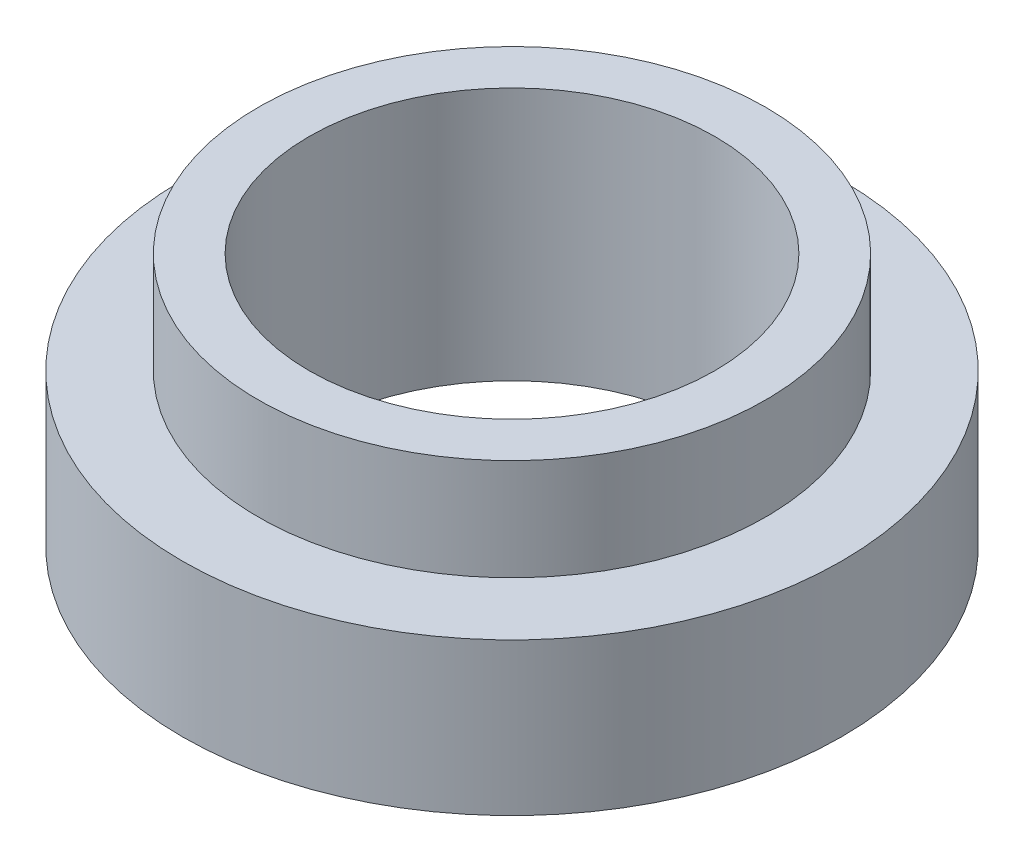
ISO-10303-21;
HEADER;
FILE_DESCRIPTION(('STEP AP214'),'2;1');
FILE_NAME('part.step','',(''),(''),'','','');
FILE_SCHEMA(('AUTOMOTIVE_DESIGN { 1 0 10303 214 1 1 1 1 }'));
ENDSEC;
DATA;
#1=APPLICATION_CONTEXT('core data for automotive mechanical design processes');
#2=APPLICATION_PROTOCOL_DEFINITION('international standard','automotive_design',2000,#1);
#3=PRODUCT_CONTEXT('',#1,'mechanical');
#4=PRODUCT('Part','Part','',(#3));
#5=PRODUCT_RELATED_PRODUCT_CATEGORY('part','',(#4));
#6=PRODUCT_DEFINITION_FORMATION('','',#4);
#7=PRODUCT_DEFINITION_CONTEXT('part definition',#1,'design');
#8=PRODUCT_DEFINITION('design','',#6,#7);
#9=PRODUCT_DEFINITION_SHAPE('','',#8);
#10=(LENGTH_UNIT() NAMED_UNIT(*) SI_UNIT(.MILLI.,.METRE.));
#11=(NAMED_UNIT(*) PLANE_ANGLE_UNIT() SI_UNIT($,.RADIAN.));
#12=(NAMED_UNIT(*) SI_UNIT($,.STERADIAN.) SOLID_ANGLE_UNIT());
#13=UNCERTAINTY_MEASURE_WITH_UNIT(LENGTH_MEASURE(1.E-05),#10,'distance_accuracy_value','');
#14=(GEOMETRIC_REPRESENTATION_CONTEXT(3) GLOBAL_UNCERTAINTY_ASSIGNED_CONTEXT((#13)) GLOBAL_UNIT_ASSIGNED_CONTEXT((#10,
#11,#12)) REPRESENTATION_CONTEXT('',''));
#15=CARTESIAN_POINT('',(0.,0.,0.));
#16=DIRECTION('',(0.,0.,1.));
#17=DIRECTION('',(1.,0.,0.));
#18=AXIS2_PLACEMENT_3D('',#15,#16,#17);
#19=CARTESIAN_POINT('',(0.,0.,0.));
#20=DIRECTION('',(0.,-1.,0.));
#21=DIRECTION('',(0.,0.,-1.));
#22=AXIS2_PLACEMENT_3D('',#19,#20,#21);
#23=CYLINDRICAL_SURFACE('',#22,6.50000000000001);
#24=CARTESIAN_POINT('',(0.,14.3177897024861,0.));
#25=DIRECTION('',(0.,-1.,0.));
#26=DIRECTION('',(0.,0.,-1.));
#27=AXIS2_PLACEMENT_3D('',#24,#25,#26);
#28=CIRCLE('',#27,6.50000000000001);
#29=CARTESIAN_POINT('',(0.,14.3177897024861,-6.50000000000001));
#30=VERTEX_POINT('',#29);
#31=EDGE_CURVE('E53',#30,#30,#28,.T.);
#32=ORIENTED_EDGE('',*,*,#31,.F.);
#33=EDGE_LOOP('',(#32));
#34=FACE_BOUND('',#33,.T.);
#35=CARTESIAN_POINT('',(0.,17.3177897024861,0.));
#36=DIRECTION('',(0.,-1.,0.));
#37=DIRECTION('',(0.,0.,-1.));
#38=AXIS2_PLACEMENT_3D('',#35,#36,#37);
#39=CIRCLE('',#38,6.50000000000001);
#40=CARTESIAN_POINT('',(0.,17.3177897024861,-6.50000000000001));
#41=VERTEX_POINT('',#40);
#42=EDGE_CURVE('E10',#41,#41,#39,.T.);
#43=ORIENTED_EDGE('',*,*,#42,.T.);
#44=EDGE_LOOP('',(#43));
#45=FACE_BOUND('',#44,.T.);
#46=ADVANCED_FACE('F31',(#34,#45),#23,.T.);
#47=CARTESIAN_POINT('',(-6.50000000000001,17.3177897024861,0.));
#48=DIRECTION('',(0.,-1.,0.));
#49=DIRECTION('',(0.,0.,-1.));
#50=AXIS2_PLACEMENT_3D('',#47,#48,#49);
#51=PLANE('',#50);
#52=ORIENTED_EDGE('',*,*,#42,.F.);
#53=EDGE_LOOP('',(#52));
#54=FACE_BOUND('',#53,.T.);
#55=CARTESIAN_POINT('',(0.,17.3177897024861,0.));
#56=DIRECTION('',(0.,-1.,0.));
#57=DIRECTION('',(0.,0.,-1.));
#58=AXIS2_PLACEMENT_3D('',#55,#56,#57);
#59=CIRCLE('',#58,4.99999999999999);
#60=CARTESIAN_POINT('',(0.,17.3177897024861,-4.99999999999999));
#61=VERTEX_POINT('',#60);
#62=EDGE_CURVE('E37',#61,#61,#59,.T.);
#63=ORIENTED_EDGE('',*,*,#62,.T.);
#64=EDGE_LOOP('',(#63));
#65=FACE_BOUND('',#64,.T.);
#66=ADVANCED_FACE('F60',(#54,#65),#51,.F.);
#67=CARTESIAN_POINT('',(0.,0.,0.));
#68=DIRECTION('',(0.,-1.,0.));
#69=DIRECTION('',(0.,0.,-1.));
#70=AXIS2_PLACEMENT_3D('',#67,#68,#69);
#71=CYLINDRICAL_SURFACE('',#70,5.);
#72=ORIENTED_EDGE('',*,*,#62,.F.);
#73=EDGE_LOOP('',(#72));
#74=FACE_BOUND('',#73,.T.);
#75=CARTESIAN_POINT('',(0.,19.3177897024861,0.));
#76=DIRECTION('',(0.,-1.,0.));
#77=DIRECTION('',(0.,0.,-1.));
#78=AXIS2_PLACEMENT_3D('',#75,#76,#77);
#79=CIRCLE('',#78,5.);
#80=CARTESIAN_POINT('',(0.,19.3177897024861,-5.));
#81=VERTEX_POINT('',#80);
#82=EDGE_CURVE('E41',#81,#81,#79,.T.);
#83=ORIENTED_EDGE('',*,*,#82,.T.);
#84=EDGE_LOOP('',(#83));
#85=FACE_BOUND('',#84,.T.);
#86=ADVANCED_FACE('F64',(#74,#85),#71,.T.);
#87=CARTESIAN_POINT('',(-5.,19.3177897024861,0.));
#88=DIRECTION('',(0.,-1.,0.));
#89=DIRECTION('',(0.,0.,-1.));
#90=AXIS2_PLACEMENT_3D('',#87,#88,#89);
#91=PLANE('',#90);
#92=ORIENTED_EDGE('',*,*,#82,.F.);
#93=EDGE_LOOP('',(#92));
#94=FACE_BOUND('',#93,.T.);
#95=CARTESIAN_POINT('',(0.,19.3177897024861,0.));
#96=DIRECTION('',(0.,-1.,0.));
#97=DIRECTION('',(0.,0.,-1.));
#98=AXIS2_PLACEMENT_3D('',#95,#96,#97);
#99=CIRCLE('',#98,4.);
#100=CARTESIAN_POINT('',(0.,19.3177897024861,-4.));
#101=VERTEX_POINT('',#100);
#102=EDGE_CURVE('E45',#101,#101,#99,.T.);
#103=ORIENTED_EDGE('',*,*,#102,.T.);
#104=EDGE_LOOP('',(#103));
#105=FACE_BOUND('',#104,.T.);
#106=ADVANCED_FACE('F69',(#94,#105),#91,.F.);
#107=CARTESIAN_POINT('',(0.,0.,0.));
#108=DIRECTION('',(0.,-1.,0.));
#109=DIRECTION('',(0.,0.,-1.));
#110=AXIS2_PLACEMENT_3D('',#107,#108,#109);
#111=CYLINDRICAL_SURFACE('',#110,4.);
#112=ORIENTED_EDGE('',*,*,#102,.F.);
#113=EDGE_LOOP('',(#112));
#114=FACE_BOUND('',#113,.T.);
#115=CARTESIAN_POINT('',(0.,14.3177897024861,0.));
#116=DIRECTION('',(0.,-1.,0.));
#117=DIRECTION('',(0.,0.,-1.));
#118=AXIS2_PLACEMENT_3D('',#115,#116,#117);
#119=CIRCLE('',#118,4.);
#120=CARTESIAN_POINT('',(0.,14.3177897024861,-4.));
#121=VERTEX_POINT('',#120);
#122=EDGE_CURVE('E50',#121,#121,#119,.T.);
#123=ORIENTED_EDGE('',*,*,#122,.T.);
#124=EDGE_LOOP('',(#123));
#125=FACE_BOUND('',#124,.T.);
#126=ADVANCED_FACE('F75',(#114,#125),#111,.F.);
#127=CARTESIAN_POINT('',(-6.50000000000001,14.3177897024861,0.));
#128=DIRECTION('',(0.,1.,0.));
#129=DIRECTION('',(0.,0.,1.));
#130=AXIS2_PLACEMENT_3D('',#127,#128,#129);
#131=PLANE('',#130);
#132=ORIENTED_EDGE('',*,*,#122,.F.);
#133=EDGE_LOOP('',(#132));
#134=FACE_BOUND('',#133,.T.);
#135=ORIENTED_EDGE('',*,*,#31,.T.);
#136=EDGE_LOOP('',(#135));
#137=FACE_BOUND('',#136,.T.);
#138=ADVANCED_FACE('F57',(#134,#137),#131,.F.);
#139=CLOSED_SHELL('',(#46,#66,#86,#106,#126,#138));
#140=MANIFOLD_SOLID_BREP('B2',#139);
#141=ADVANCED_BREP_SHAPE_REPRESENTATION('',(#18,#140),#14);
#142=SHAPE_DEFINITION_REPRESENTATION(#9,#141);
ENDSEC;
END-ISO-10303-21;
